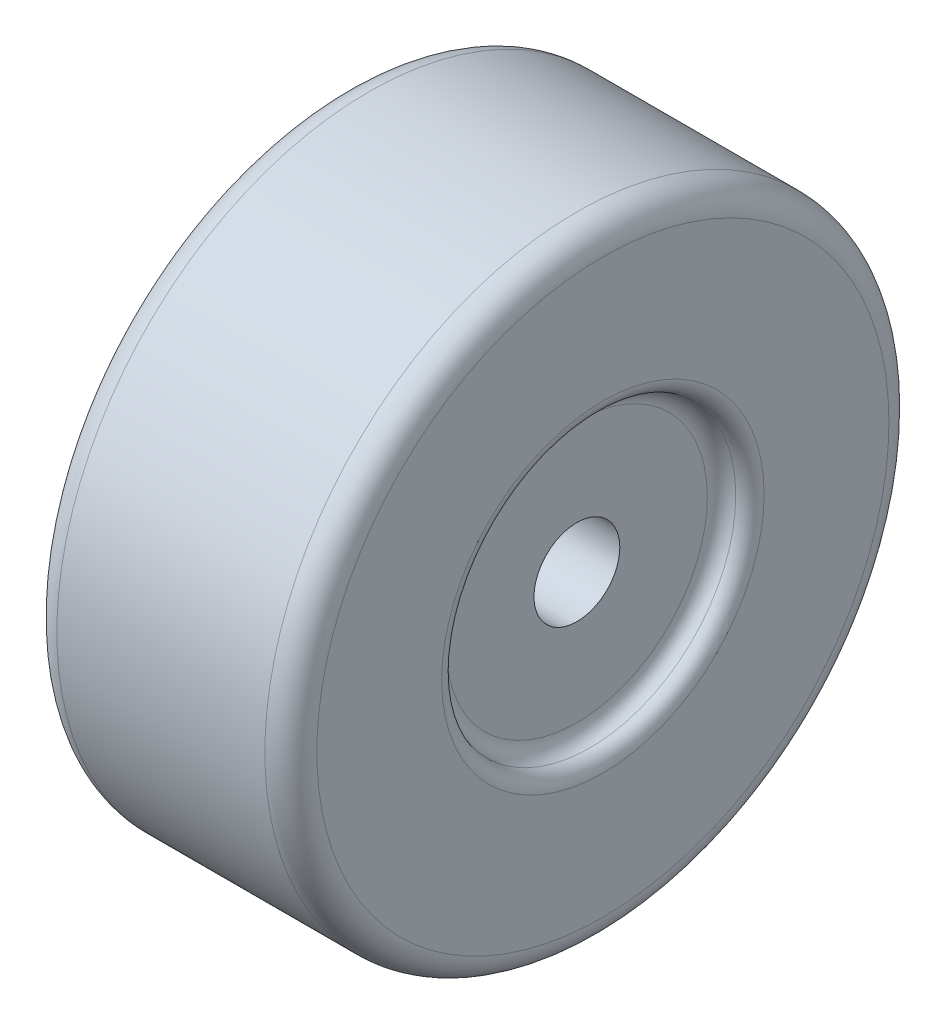
ISO-10303-21;
HEADER;
FILE_DESCRIPTION(('STEP AP214'),'2;1');
FILE_NAME('part.step','',(''),(''),'','','');
FILE_SCHEMA(('AUTOMOTIVE_DESIGN { 1 0 10303 214 1 1 1 1 }'));
ENDSEC;
DATA;
#1=APPLICATION_CONTEXT('core data for automotive mechanical design processes');
#2=APPLICATION_PROTOCOL_DEFINITION('international standard','automotive_design',2000,#1);
#3=PRODUCT_CONTEXT('',#1,'mechanical');
#4=PRODUCT('Part','Part','',(#3));
#5=PRODUCT_RELATED_PRODUCT_CATEGORY('part','',(#4));
#6=PRODUCT_DEFINITION_FORMATION('','',#4);
#7=PRODUCT_DEFINITION_CONTEXT('part definition',#1,'design');
#8=PRODUCT_DEFINITION('design','',#6,#7);
#9=PRODUCT_DEFINITION_SHAPE('','',#8);
#10=(LENGTH_UNIT() NAMED_UNIT(*) SI_UNIT(.MILLI.,.METRE.));
#11=(NAMED_UNIT(*) PLANE_ANGLE_UNIT() SI_UNIT($,.RADIAN.));
#12=(NAMED_UNIT(*) SI_UNIT($,.STERADIAN.) SOLID_ANGLE_UNIT());
#13=UNCERTAINTY_MEASURE_WITH_UNIT(LENGTH_MEASURE(1.E-05),#10,'distance_accuracy_value','');
#14=(GEOMETRIC_REPRESENTATION_CONTEXT(3) GLOBAL_UNCERTAINTY_ASSIGNED_CONTEXT((#13)) GLOBAL_UNIT_ASSIGNED_CONTEXT((#10,
#11,#12)) REPRESENTATION_CONTEXT('',''));
#15=CARTESIAN_POINT('',(0.,0.,0.));
#16=DIRECTION('',(0.,0.,1.));
#17=DIRECTION('',(1.,0.,0.));
#18=AXIS2_PLACEMENT_3D('',#15,#16,#17);
#19=CARTESIAN_POINT('',(-25.,0.,0.));
#20=DIRECTION('',(1.,0.,0.));
#21=DIRECTION('',(0.,0.,-1.));
#22=AXIS2_PLACEMENT_3D('',#19,#20,#21);
#23=CYLINDRICAL_SURFACE('',#22,8.25);
#24=CARTESIAN_POINT('',(20.,0.,0.));
#25=DIRECTION('',(1.,0.,0.));
#26=DIRECTION('',(0.,0.,-1.));
#27=AXIS2_PLACEMENT_3D('',#24,#25,#26);
#28=CIRCLE('',#27,8.25);
#29=CARTESIAN_POINT('',(20.,0.,-8.25));
#30=VERTEX_POINT('',#29);
#31=EDGE_CURVE('E62',#30,#30,#28,.F.);
#32=ORIENTED_EDGE('',*,*,#31,.F.);
#33=EDGE_LOOP('',(#32));
#34=FACE_BOUND('',#33,.T.);
#35=CARTESIAN_POINT('',(-20.,0.,0.));
#36=DIRECTION('',(-1.,0.,0.));
#37=DIRECTION('',(0.,0.,1.));
#38=AXIS2_PLACEMENT_3D('',#35,#36,#37);
#39=CIRCLE('',#38,8.25);
#40=CARTESIAN_POINT('',(-20.,0.,8.25));
#41=VERTEX_POINT('',#40);
#42=EDGE_CURVE('E58',#41,#41,#39,.F.);
#43=ORIENTED_EDGE('',*,*,#42,.F.);
#44=EDGE_LOOP('',(#43));
#45=FACE_BOUND('',#44,.T.);
#46=ADVANCED_FACE('F37',(#34,#45),#23,.F.);
#47=CARTESIAN_POINT('',(25.,0.,0.));
#48=DIRECTION('',(-1.,0.,0.));
#49=DIRECTION('',(0.,0.,1.));
#50=AXIS2_PLACEMENT_3D('',#47,#48,#49);
#51=CYLINDRICAL_SURFACE('',#50,60.);
#52=CARTESIAN_POINT('',(-20.,0.,0.));
#53=DIRECTION('',(1.,0.,0.));
#54=DIRECTION('',(0.,0.,-1.));
#55=AXIS2_PLACEMENT_3D('',#52,#53,#54);
#56=CIRCLE('',#55,60.);
#57=CARTESIAN_POINT('',(-20.,0.,-60.));
#58=VERTEX_POINT('',#57);
#59=EDGE_CURVE('E86',#58,#58,#56,.T.);
#60=ORIENTED_EDGE('',*,*,#59,.T.);
#61=EDGE_LOOP('',(#60));
#62=FACE_BOUND('',#61,.T.);
#63=CARTESIAN_POINT('',(20.,0.,0.));
#64=DIRECTION('',(1.,0.,0.));
#65=DIRECTION('',(0.,0.,-1.));
#66=AXIS2_PLACEMENT_3D('',#63,#64,#65);
#67=CIRCLE('',#66,60.);
#68=CARTESIAN_POINT('',(20.,0.,-60.));
#69=VERTEX_POINT('',#68);
#70=EDGE_CURVE('E78',#69,#69,#67,.F.);
#71=ORIENTED_EDGE('',*,*,#70,.T.);
#72=EDGE_LOOP('',(#71));
#73=FACE_BOUND('',#72,.T.);
#74=ADVANCED_FACE('F94',(#62,#73),#51,.T.);
#75=CARTESIAN_POINT('',(25.,0.,0.));
#76=DIRECTION('',(1.,0.,0.));
#77=DIRECTION('',(0.,0.,-1.));
#78=AXIS2_PLACEMENT_3D('',#75,#76,#77);
#79=PLANE('',#78);
#80=CARTESIAN_POINT('',(25.,0.,0.));
#81=DIRECTION('',(1.,0.,0.));
#82=DIRECTION('',(0.,0.,-1.));
#83=AXIS2_PLACEMENT_3D('',#80,#81,#82);
#84=CIRCLE('',#83,31.);
#85=CARTESIAN_POINT('',(25.,0.,-31.));
#86=VERTEX_POINT('',#85);
#87=EDGE_CURVE('E70',#86,#86,#84,.F.);
#88=ORIENTED_EDGE('',*,*,#87,.T.);
#89=EDGE_LOOP('',(#88));
#90=FACE_BOUND('',#89,.T.);
#91=CARTESIAN_POINT('',(25.,0.,0.));
#92=DIRECTION('',(1.,0.,0.));
#93=DIRECTION('',(0.,0.,-1.));
#94=AXIS2_PLACEMENT_3D('',#91,#92,#93);
#95=CIRCLE('',#94,55.);
#96=CARTESIAN_POINT('',(25.,0.,-55.));
#97=VERTEX_POINT('',#96);
#98=EDGE_CURVE('E74',#97,#97,#95,.T.);
#99=ORIENTED_EDGE('',*,*,#98,.T.);
#100=EDGE_LOOP('',(#99));
#101=FACE_BOUND('',#100,.T.);
#102=ADVANCED_FACE('F104',(#90,#101),#79,.T.);
#103=CARTESIAN_POINT('',(-25.,0.,0.));
#104=DIRECTION('',(1.,0.,0.));
#105=DIRECTION('',(0.,0.,-1.));
#106=AXIS2_PLACEMENT_3D('',#103,#104,#105);
#107=PLANE('',#106);
#108=CARTESIAN_POINT('',(-25.,0.,0.));
#109=DIRECTION('',(1.,0.,0.));
#110=DIRECTION('',(0.,0.,-1.));
#111=AXIS2_PLACEMENT_3D('',#108,#109,#110);
#112=CIRCLE('',#111,31.);
#113=CARTESIAN_POINT('',(-25.,0.,-31.));
#114=VERTEX_POINT('',#113);
#115=EDGE_CURVE('E50',#114,#114,#112,.T.);
#116=ORIENTED_EDGE('',*,*,#115,.T.);
#117=EDGE_LOOP('',(#116));
#118=FACE_BOUND('',#117,.T.);
#119=CARTESIAN_POINT('',(-25.,0.,0.));
#120=DIRECTION('',(1.,0.,0.));
#121=DIRECTION('',(0.,0.,-1.));
#122=AXIS2_PLACEMENT_3D('',#119,#120,#121);
#123=CIRCLE('',#122,55.);
#124=CARTESIAN_POINT('',(-25.,0.,-55.));
#125=VERTEX_POINT('',#124);
#126=EDGE_CURVE('E82',#125,#125,#123,.F.);
#127=ORIENTED_EDGE('',*,*,#126,.T.);
#128=EDGE_LOOP('',(#127));
#129=FACE_BOUND('',#128,.T.);
#130=ADVANCED_FACE('F106',(#118,#129),#107,.F.);
#131=CARTESIAN_POINT('',(-20.,0.,0.));
#132=DIRECTION('',(1.,0.,0.));
#133=DIRECTION('',(0.,0.,-1.));
#134=AXIS2_PLACEMENT_3D('',#131,#132,#133);
#135=TOROIDAL_SURFACE('',#134,55.,5.);
#136=ORIENTED_EDGE('',*,*,#126,.F.);
#137=EDGE_LOOP('',(#136));
#138=FACE_BOUND('',#137,.T.);
#139=ORIENTED_EDGE('',*,*,#59,.F.);
#140=EDGE_LOOP('',(#139));
#141=FACE_BOUND('',#140,.T.);
#142=ADVANCED_FACE('F100',(#138,#141),#135,.T.);
#143=CARTESIAN_POINT('',(20.,0.,0.));
#144=DIRECTION('',(1.,0.,0.));
#145=DIRECTION('',(0.,0.,-1.));
#146=AXIS2_PLACEMENT_3D('',#143,#144,#145);
#147=TOROIDAL_SURFACE('',#146,55.,5.);
#148=ORIENTED_EDGE('',*,*,#70,.F.);
#149=EDGE_LOOP('',(#148));
#150=FACE_BOUND('',#149,.T.);
#151=ORIENTED_EDGE('',*,*,#98,.F.);
#152=EDGE_LOOP('',(#151));
#153=FACE_BOUND('',#152,.T.);
#154=ADVANCED_FACE('F96',(#150,#153),#147,.T.);
#155=CARTESIAN_POINT('',(20.,0.,0.));
#156=DIRECTION('',(1.,0.,0.));
#157=DIRECTION('',(0.,0.,-1.));
#158=AXIS2_PLACEMENT_3D('',#155,#156,#157);
#159=PLANE('',#158);
#160=CARTESIAN_POINT('',(20.,0.,0.));
#161=DIRECTION('',(1.,0.,0.));
#162=DIRECTION('',(0.,0.,-1.));
#163=AXIS2_PLACEMENT_3D('',#160,#161,#162);
#164=CIRCLE('',#163,25.0839202169004);
#165=CARTESIAN_POINT('',(20.,0.,-25.0839202169004));
#166=VERTEX_POINT('',#165);
#167=EDGE_CURVE('E66',#166,#166,#164,.T.);
#168=ORIENTED_EDGE('',*,*,#167,.T.);
#169=EDGE_LOOP('',(#168));
#170=FACE_BOUND('',#169,.T.);
#171=ORIENTED_EDGE('',*,*,#31,.T.);
#172=EDGE_LOOP('',(#171));
#173=FACE_BOUND('',#172,.T.);
#174=ADVANCED_FACE('F99',(#170,#173),#159,.T.);
#175=CARTESIAN_POINT('',(22.,0.,0.));
#176=DIRECTION('',(1.,0.,0.));
#177=DIRECTION('',(0.,0.,-1.));
#178=AXIS2_PLACEMENT_3D('',#175,#176,#177);
#179=TOROIDAL_SURFACE('',#178,31.,3.);
#180=CARTESIAN_POINT('',(22.5,0.,0.));
#181=DIRECTION('',(-1.,0.,0.));
#182=DIRECTION('',(0.,0.,1.));
#183=AXIS2_PLACEMENT_3D('',#180,#181,#182);
#184=CIRCLE('',#183,28.0419601084502);
#185=CARTESIAN_POINT('',(22.5,0.,28.0419601084502));
#186=VERTEX_POINT('',#185);
#187=EDGE_CURVE('E55',#186,#186,#184,.T.);
#188=ORIENTED_EDGE('',*,*,#187,.T.);
#189=EDGE_LOOP('',(#188));
#190=FACE_BOUND('',#189,.T.);
#191=ORIENTED_EDGE('',*,*,#87,.F.);
#192=EDGE_LOOP('',(#191));
#193=FACE_BOUND('',#192,.T.);
#194=ADVANCED_FACE('F127',(#190,#193),#179,.T.);
#195=CARTESIAN_POINT('',(23.,0.,0.));
#196=DIRECTION('',(-1.,0.,0.));
#197=DIRECTION('',(0.,0.,1.));
#198=AXIS2_PLACEMENT_3D('',#195,#196,#197);
#199=TOROIDAL_SURFACE('',#198,25.0839202169004,3.);
#200=ORIENTED_EDGE('',*,*,#187,.F.);
#201=EDGE_LOOP('',(#200));
#202=FACE_BOUND('',#201,.T.);
#203=ORIENTED_EDGE('',*,*,#167,.F.);
#204=EDGE_LOOP('',(#203));
#205=FACE_BOUND('',#204,.T.);
#206=ADVANCED_FACE('F132',(#202,#205),#199,.F.);
#207=CARTESIAN_POINT('',(-20.,0.,0.));
#208=DIRECTION('',(-1.,0.,0.));
#209=DIRECTION('',(0.,0.,1.));
#210=AXIS2_PLACEMENT_3D('',#207,#208,#209);
#211=PLANE('',#210);
#212=CARTESIAN_POINT('',(-20.,0.,0.));
#213=DIRECTION('',(-1.,0.,0.));
#214=DIRECTION('',(0.,0.,1.));
#215=AXIS2_PLACEMENT_3D('',#212,#213,#214);
#216=CIRCLE('',#215,25.0839202169004);
#217=CARTESIAN_POINT('',(-20.,0.,25.0839202169004));
#218=VERTEX_POINT('',#217);
#219=EDGE_CURVE('E45',#218,#218,#216,.T.);
#220=ORIENTED_EDGE('',*,*,#219,.T.);
#221=EDGE_LOOP('',(#220));
#222=FACE_BOUND('',#221,.T.);
#223=ORIENTED_EDGE('',*,*,#42,.T.);
#224=EDGE_LOOP('',(#223));
#225=FACE_BOUND('',#224,.T.);
#226=ADVANCED_FACE('F129',(#222,#225),#211,.T.);
#227=CARTESIAN_POINT('',(-22.,0.,0.));
#228=DIRECTION('',(1.,0.,0.));
#229=DIRECTION('',(0.,0.,-1.));
#230=AXIS2_PLACEMENT_3D('',#227,#228,#229);
#231=TOROIDAL_SURFACE('',#230,31.,3.);
#232=CARTESIAN_POINT('',(-22.5,0.,0.));
#233=DIRECTION('',(1.,0.,0.));
#234=DIRECTION('',(0.,0.,-1.));
#235=AXIS2_PLACEMENT_3D('',#232,#233,#234);
#236=CIRCLE('',#235,28.0419601084502);
#237=CARTESIAN_POINT('',(-22.5,0.,-28.0419601084502));
#238=VERTEX_POINT('',#237);
#239=EDGE_CURVE('E10',#238,#238,#236,.T.);
#240=ORIENTED_EDGE('',*,*,#239,.T.);
#241=EDGE_LOOP('',(#240));
#242=FACE_BOUND('',#241,.T.);
#243=ORIENTED_EDGE('',*,*,#115,.F.);
#244=EDGE_LOOP('',(#243));
#245=FACE_BOUND('',#244,.T.);
#246=ADVANCED_FACE('F131',(#242,#245),#231,.T.);
#247=CARTESIAN_POINT('',(-23.,0.,0.));
#248=DIRECTION('',(1.,0.,0.));
#249=DIRECTION('',(0.,0.,-1.));
#250=AXIS2_PLACEMENT_3D('',#247,#248,#249);
#251=TOROIDAL_SURFACE('',#250,25.0839202169004,3.);
#252=ORIENTED_EDGE('',*,*,#239,.F.);
#253=EDGE_LOOP('',(#252));
#254=FACE_BOUND('',#253,.T.);
#255=ORIENTED_EDGE('',*,*,#219,.F.);
#256=EDGE_LOOP('',(#255));
#257=FACE_BOUND('',#256,.T.);
#258=ADVANCED_FACE('F39',(#254,#257),#251,.F.);
#259=CLOSED_SHELL('',(#46,#74,#102,#130,#142,#154,#174,#194,#206,#226,#246,#258));
#260=MANIFOLD_SOLID_BREP('B2',#259);
#261=ADVANCED_BREP_SHAPE_REPRESENTATION('',(#18,#260),#14);
#262=SHAPE_DEFINITION_REPRESENTATION(#9,#261);
ENDSEC;
END-ISO-10303-21;
